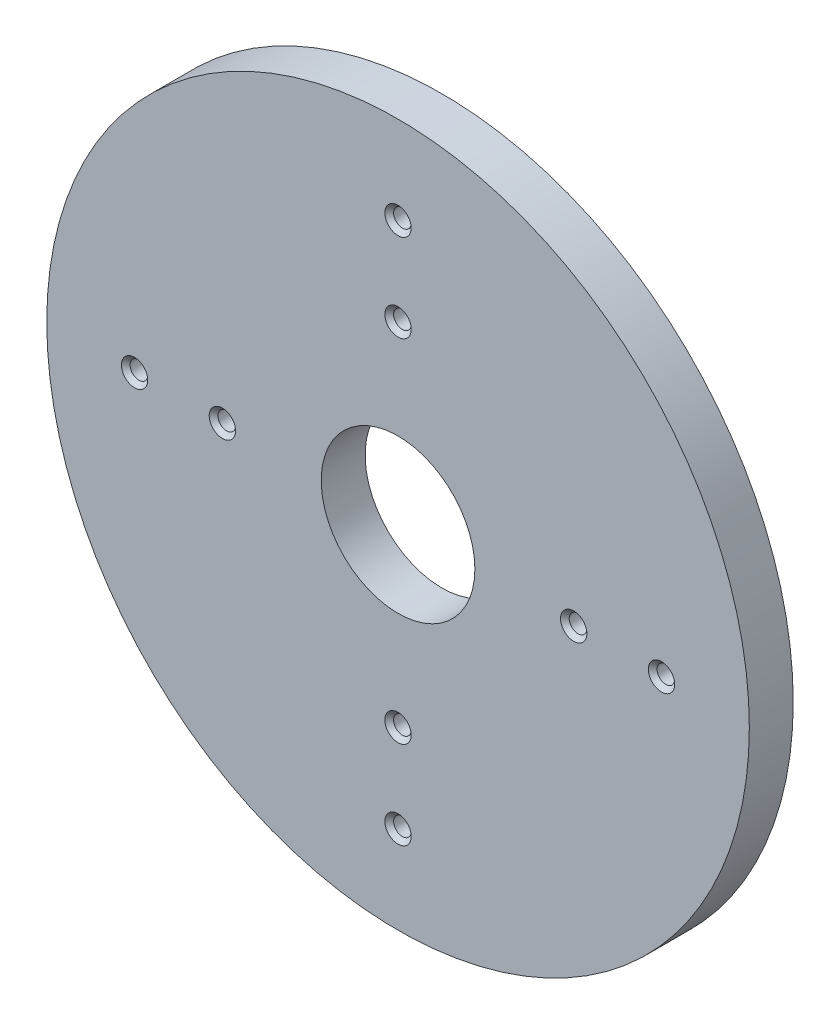
ISO-10303-21;
HEADER;
FILE_DESCRIPTION(('STEP AP214'),'2;1');
FILE_NAME('part.step','',(''),(''),'','','');
FILE_SCHEMA(('AUTOMOTIVE_DESIGN { 1 0 10303 214 1 1 1 1 }'));
ENDSEC;
DATA;
#1=APPLICATION_CONTEXT('core data for automotive mechanical design processes');
#2=APPLICATION_PROTOCOL_DEFINITION('international standard','automotive_design',2000,#1);
#3=PRODUCT_CONTEXT('',#1,'mechanical');
#4=PRODUCT('Part','Part','',(#3));
#5=PRODUCT_RELATED_PRODUCT_CATEGORY('part','',(#4));
#6=PRODUCT_DEFINITION_FORMATION('','',#4);
#7=PRODUCT_DEFINITION_CONTEXT('part definition',#1,'design');
#8=PRODUCT_DEFINITION('design','',#6,#7);
#9=PRODUCT_DEFINITION_SHAPE('','',#8);
#10=(LENGTH_UNIT() NAMED_UNIT(*) SI_UNIT(.MILLI.,.METRE.));
#11=(NAMED_UNIT(*) PLANE_ANGLE_UNIT() SI_UNIT($,.RADIAN.));
#12=(NAMED_UNIT(*) SI_UNIT($,.STERADIAN.) SOLID_ANGLE_UNIT());
#13=UNCERTAINTY_MEASURE_WITH_UNIT(LENGTH_MEASURE(1.E-05),#10,'distance_accuracy_value','');
#14=(GEOMETRIC_REPRESENTATION_CONTEXT(3) GLOBAL_UNCERTAINTY_ASSIGNED_CONTEXT((#13)) GLOBAL_UNIT_ASSIGNED_CONTEXT((#10,
#11,#12)) REPRESENTATION_CONTEXT('',''));
#15=CARTESIAN_POINT('',(0.,0.,0.));
#16=DIRECTION('',(0.,0.,1.));
#17=DIRECTION('',(1.,0.,0.));
#18=AXIS2_PLACEMENT_3D('',#15,#16,#17);
#19=CARTESIAN_POINT('',(0.,0.,12.7));
#20=DIRECTION('',(0.,0.,1.));
#21=DIRECTION('',(1.,0.,0.));
#22=AXIS2_PLACEMENT_3D('',#19,#20,#21);
#23=PLANE('',#22);
#24=CARTESIAN_POINT('',(0.,76.2,12.7));
#25=DIRECTION('',(0.,0.,1.));
#26=DIRECTION('',(1.,0.,0.));
#27=AXIS2_PLACEMENT_3D('',#24,#25,#26);
#28=CIRCLE('',#27,3.81);
#29=CARTESIAN_POINT('',(3.81,76.2,12.7));
#30=VERTEX_POINT('',#29);
#31=EDGE_CURVE('E149',#30,#30,#28,.T.);
#32=ORIENTED_EDGE('',*,*,#31,.F.);
#33=EDGE_LOOP('',(#32));
#34=FACE_BOUND('',#33,.T.);
#35=CARTESIAN_POINT('',(0.,50.8,12.7));
#36=DIRECTION('',(0.,0.,1.));
#37=DIRECTION('',(1.,0.,0.));
#38=AXIS2_PLACEMENT_3D('',#35,#36,#37);
#39=CIRCLE('',#38,3.81);
#40=CARTESIAN_POINT('',(3.81,50.8,12.7));
#41=VERTEX_POINT('',#40);
#42=EDGE_CURVE('E137',#41,#41,#39,.T.);
#43=ORIENTED_EDGE('',*,*,#42,.F.);
#44=EDGE_LOOP('',(#43));
#45=FACE_BOUND('',#44,.T.);
#46=CARTESIAN_POINT('',(76.2000000000014,1.43604633188994E-12,12.7));
#47=DIRECTION('',(0.,0.,1.));
#48=DIRECTION('',(1.,0.,0.));
#49=AXIS2_PLACEMENT_3D('',#46,#47,#48);
#50=CIRCLE('',#49,3.80999999999999);
#51=CARTESIAN_POINT('',(80.0100000000014,1.43604633188994E-12,12.7));
#52=VERTEX_POINT('',#51);
#53=EDGE_CURVE('E125',#52,#52,#50,.T.);
#54=ORIENTED_EDGE('',*,*,#53,.F.);
#55=EDGE_LOOP('',(#54));
#56=FACE_BOUND('',#55,.T.);
#57=CARTESIAN_POINT('',(50.8000000000014,1.43449103045502E-12,12.7));
#58=DIRECTION('',(0.,0.,1.));
#59=DIRECTION('',(1.,0.,0.));
#60=AXIS2_PLACEMENT_3D('',#57,#58,#59);
#61=CIRCLE('',#60,3.81);
#62=CARTESIAN_POINT('',(54.6100000000014,1.43449103045502E-12,12.7));
#63=VERTEX_POINT('',#62);
#64=EDGE_CURVE('E113',#63,#63,#61,.T.);
#65=ORIENTED_EDGE('',*,*,#64,.F.);
#66=EDGE_LOOP('',(#65));
#67=FACE_BOUND('',#66,.T.);
#68=CARTESIAN_POINT('',(2.87209266377988E-12,-76.2,12.7));
#69=DIRECTION('',(0.,0.,1.));
#70=DIRECTION('',(1.,0.,0.));
#71=AXIS2_PLACEMENT_3D('',#68,#69,#70);
#72=CIRCLE('',#71,3.81);
#73=CARTESIAN_POINT('',(3.81000000000287,-76.2,12.7));
#74=VERTEX_POINT('',#73);
#75=EDGE_CURVE('E101',#74,#74,#72,.T.);
#76=ORIENTED_EDGE('',*,*,#75,.F.);
#77=EDGE_LOOP('',(#76));
#78=FACE_BOUND('',#77,.T.);
#79=CARTESIAN_POINT('',(2.86898206091004E-12,-50.8,12.7));
#80=DIRECTION('',(0.,0.,1.));
#81=DIRECTION('',(1.,0.,0.));
#82=AXIS2_PLACEMENT_3D('',#79,#80,#81);
#83=CIRCLE('',#82,3.81);
#84=CARTESIAN_POINT('',(3.81000000000287,-50.8,12.7));
#85=VERTEX_POINT('',#84);
#86=EDGE_CURVE('E89',#85,#85,#83,.T.);
#87=ORIENTED_EDGE('',*,*,#86,.F.);
#88=EDGE_LOOP('',(#87));
#89=FACE_BOUND('',#88,.T.);
#90=CARTESIAN_POINT('',(-76.1999999999986,-1.42671452328043E-12,12.7));
#91=DIRECTION('',(0.,0.,1.));
#92=DIRECTION('',(1.,0.,0.));
#93=AXIS2_PLACEMENT_3D('',#90,#91,#92);
#94=CIRCLE('',#93,3.80999999999999);
#95=CARTESIAN_POINT('',(-72.3899999999986,-1.42671452328043E-12,12.7));
#96=VERTEX_POINT('',#95);
#97=EDGE_CURVE('E77',#96,#96,#94,.T.);
#98=ORIENTED_EDGE('',*,*,#97,.F.);
#99=EDGE_LOOP('',(#98));
#100=FACE_BOUND('',#99,.T.);
#101=CARTESIAN_POINT('',(-50.7999999999986,-1.42826982471535E-12,12.7));
#102=DIRECTION('',(0.,0.,1.));
#103=DIRECTION('',(1.,0.,0.));
#104=AXIS2_PLACEMENT_3D('',#101,#102,#103);
#105=CIRCLE('',#104,3.81);
#106=CARTESIAN_POINT('',(-46.9899999999986,-1.42826982471535E-12,12.7));
#107=VERTEX_POINT('',#106);
#108=EDGE_CURVE('E65',#107,#107,#105,.T.);
#109=ORIENTED_EDGE('',*,*,#108,.F.);
#110=EDGE_LOOP('',(#109));
#111=FACE_BOUND('',#110,.T.);
#112=CARTESIAN_POINT('',(0.,0.,12.7));
#113=DIRECTION('',(0.,0.,1.));
#114=DIRECTION('',(1.,0.,0.));
#115=AXIS2_PLACEMENT_3D('',#112,#113,#114);
#116=CIRCLE('',#115,101.6);
#117=CARTESIAN_POINT('',(101.6,0.,12.7));
#118=VERTEX_POINT('',#117);
#119=EDGE_CURVE('E10',#118,#118,#116,.T.);
#120=ORIENTED_EDGE('',*,*,#119,.T.);
#121=EDGE_LOOP('',(#120));
#122=FACE_BOUND('',#121,.T.);
#123=CARTESIAN_POINT('',(0.,0.,12.7));
#124=DIRECTION('',(0.,0.,1.));
#125=DIRECTION('',(1.,0.,0.));
#126=AXIS2_PLACEMENT_3D('',#123,#124,#125);
#127=CIRCLE('',#126,22.225);
#128=CARTESIAN_POINT('',(22.225,0.,12.7));
#129=VERTEX_POINT('',#128);
#130=EDGE_CURVE('E52',#129,#129,#127,.T.);
#131=ORIENTED_EDGE('',*,*,#130,.F.);
#132=EDGE_LOOP('',(#131));
#133=FACE_BOUND('',#132,.T.);
#134=ADVANCED_FACE('F41',(#34,#45,#56,#67,#78,#89,#100,#111,#122,#133),#23,.T.);
#135=CARTESIAN_POINT('',(0.,0.,0.));
#136=DIRECTION('',(0.,0.,1.));
#137=DIRECTION('',(1.,0.,0.));
#138=AXIS2_PLACEMENT_3D('',#135,#136,#137);
#139=PLANE('',#138);
#140=CARTESIAN_POINT('',(0.,76.2,0.));
#141=DIRECTION('',(0.,0.,1.));
#142=DIRECTION('',(1.,0.,0.));
#143=AXIS2_PLACEMENT_3D('',#140,#141,#142);
#144=CIRCLE('',#143,3.81);
#145=CARTESIAN_POINT('',(3.81,76.2,0.));
#146=VERTEX_POINT('',#145);
#147=EDGE_CURVE('E152',#146,#146,#144,.T.);
#148=ORIENTED_EDGE('',*,*,#147,.T.);
#149=EDGE_LOOP('',(#148));
#150=FACE_BOUND('',#149,.T.);
#151=CARTESIAN_POINT('',(0.,50.8,0.));
#152=DIRECTION('',(0.,0.,1.));
#153=DIRECTION('',(1.,0.,0.));
#154=AXIS2_PLACEMENT_3D('',#151,#152,#153);
#155=CIRCLE('',#154,3.81);
#156=CARTESIAN_POINT('',(3.81,50.8,0.));
#157=VERTEX_POINT('',#156);
#158=EDGE_CURVE('E140',#157,#157,#155,.T.);
#159=ORIENTED_EDGE('',*,*,#158,.T.);
#160=EDGE_LOOP('',(#159));
#161=FACE_BOUND('',#160,.T.);
#162=CARTESIAN_POINT('',(76.2000000000014,1.43604633188994E-12,0.));
#163=DIRECTION('',(0.,0.,1.));
#164=DIRECTION('',(1.,0.,0.));
#165=AXIS2_PLACEMENT_3D('',#162,#163,#164);
#166=CIRCLE('',#165,3.80999999999999);
#167=CARTESIAN_POINT('',(80.0100000000014,1.43604633188994E-12,0.));
#168=VERTEX_POINT('',#167);
#169=EDGE_CURVE('E128',#168,#168,#166,.T.);
#170=ORIENTED_EDGE('',*,*,#169,.T.);
#171=EDGE_LOOP('',(#170));
#172=FACE_BOUND('',#171,.T.);
#173=CARTESIAN_POINT('',(50.8000000000014,1.43449103045502E-12,0.));
#174=DIRECTION('',(0.,0.,1.));
#175=DIRECTION('',(1.,0.,0.));
#176=AXIS2_PLACEMENT_3D('',#173,#174,#175);
#177=CIRCLE('',#176,3.80999999999999);
#178=CARTESIAN_POINT('',(54.6100000000014,1.43449103045502E-12,0.));
#179=VERTEX_POINT('',#178);
#180=EDGE_CURVE('E116',#179,#179,#177,.T.);
#181=ORIENTED_EDGE('',*,*,#180,.T.);
#182=EDGE_LOOP('',(#181));
#183=FACE_BOUND('',#182,.T.);
#184=CARTESIAN_POINT('',(2.87209266377988E-12,-76.2,0.));
#185=DIRECTION('',(0.,0.,1.));
#186=DIRECTION('',(1.,0.,0.));
#187=AXIS2_PLACEMENT_3D('',#184,#185,#186);
#188=CIRCLE('',#187,3.81);
#189=CARTESIAN_POINT('',(3.81000000000287,-76.2,0.));
#190=VERTEX_POINT('',#189);
#191=EDGE_CURVE('E104',#190,#190,#188,.T.);
#192=ORIENTED_EDGE('',*,*,#191,.T.);
#193=EDGE_LOOP('',(#192));
#194=FACE_BOUND('',#193,.T.);
#195=CARTESIAN_POINT('',(2.86898206091004E-12,-50.8,0.));
#196=DIRECTION('',(0.,0.,1.));
#197=DIRECTION('',(1.,0.,0.));
#198=AXIS2_PLACEMENT_3D('',#195,#196,#197);
#199=CIRCLE('',#198,3.81);
#200=CARTESIAN_POINT('',(3.81000000000287,-50.8,0.));
#201=VERTEX_POINT('',#200);
#202=EDGE_CURVE('E92',#201,#201,#199,.T.);
#203=ORIENTED_EDGE('',*,*,#202,.T.);
#204=EDGE_LOOP('',(#203));
#205=FACE_BOUND('',#204,.T.);
#206=CARTESIAN_POINT('',(-76.1999999999986,-1.42671452328043E-12,0.));
#207=DIRECTION('',(0.,0.,1.));
#208=DIRECTION('',(1.,0.,0.));
#209=AXIS2_PLACEMENT_3D('',#206,#207,#208);
#210=CIRCLE('',#209,3.80999999999999);
#211=CARTESIAN_POINT('',(-72.3899999999986,-1.42671452328043E-12,0.));
#212=VERTEX_POINT('',#211);
#213=EDGE_CURVE('E80',#212,#212,#210,.T.);
#214=ORIENTED_EDGE('',*,*,#213,.T.);
#215=EDGE_LOOP('',(#214));
#216=FACE_BOUND('',#215,.T.);
#217=CARTESIAN_POINT('',(-50.7999999999986,-1.42826982471535E-12,0.));
#218=DIRECTION('',(0.,0.,1.));
#219=DIRECTION('',(1.,0.,0.));
#220=AXIS2_PLACEMENT_3D('',#217,#218,#219);
#221=CIRCLE('',#220,3.80999999999999);
#222=CARTESIAN_POINT('',(-46.9899999999986,-1.42826982471535E-12,0.));
#223=VERTEX_POINT('',#222);
#224=EDGE_CURVE('E68',#223,#223,#221,.T.);
#225=ORIENTED_EDGE('',*,*,#224,.T.);
#226=EDGE_LOOP('',(#225));
#227=FACE_BOUND('',#226,.T.);
#228=CARTESIAN_POINT('',(0.,0.,0.));
#229=DIRECTION('',(0.,0.,1.));
#230=DIRECTION('',(1.,0.,0.));
#231=AXIS2_PLACEMENT_3D('',#228,#229,#230);
#232=CIRCLE('',#231,101.6);
#233=CARTESIAN_POINT('',(101.6,0.,0.));
#234=VERTEX_POINT('',#233);
#235=EDGE_CURVE('E45',#234,#234,#232,.T.);
#236=ORIENTED_EDGE('',*,*,#235,.F.);
#237=EDGE_LOOP('',(#236));
#238=FACE_BOUND('',#237,.T.);
#239=CARTESIAN_POINT('',(0.,0.,0.));
#240=DIRECTION('',(0.,0.,1.));
#241=DIRECTION('',(1.,0.,0.));
#242=AXIS2_PLACEMENT_3D('',#239,#240,#241);
#243=CIRCLE('',#242,22.225);
#244=CARTESIAN_POINT('',(22.225,0.,0.));
#245=VERTEX_POINT('',#244);
#246=EDGE_CURVE('E54',#245,#245,#243,.T.);
#247=ORIENTED_EDGE('',*,*,#246,.T.);
#248=EDGE_LOOP('',(#247));
#249=FACE_BOUND('',#248,.T.);
#250=ADVANCED_FACE('F156',(#150,#161,#172,#183,#194,#205,#216,#227,#238,#249),#139,.F.);
#251=CARTESIAN_POINT('',(0.,0.,12.7));
#252=DIRECTION('',(0.,0.,-1.));
#253=DIRECTION('',(-1.,0.,0.));
#254=AXIS2_PLACEMENT_3D('',#251,#252,#253);
#255=CYLINDRICAL_SURFACE('',#254,101.6);
#256=ORIENTED_EDGE('',*,*,#119,.F.);
#257=EDGE_LOOP('',(#256));
#258=FACE_BOUND('',#257,.T.);
#259=ORIENTED_EDGE('',*,*,#235,.T.);
#260=EDGE_LOOP('',(#259));
#261=FACE_BOUND('',#260,.T.);
#262=ADVANCED_FACE('F43',(#258,#261),#255,.T.);
#263=CARTESIAN_POINT('',(0.,0.,12.7));
#264=DIRECTION('',(0.,0.,-1.));
#265=DIRECTION('',(-1.,0.,0.));
#266=AXIS2_PLACEMENT_3D('',#263,#264,#265);
#267=CYLINDRICAL_SURFACE('',#266,22.225);
#268=ORIENTED_EDGE('',*,*,#130,.T.);
#269=EDGE_LOOP('',(#268));
#270=FACE_BOUND('',#269,.T.);
#271=ORIENTED_EDGE('',*,*,#246,.F.);
#272=EDGE_LOOP('',(#271));
#273=FACE_BOUND('',#272,.T.);
#274=ADVANCED_FACE('F197',(#270,#273),#267,.F.);
#275=CARTESIAN_POINT('',(-50.7999999999986,-1.42826982471535E-12,1.2573));
#276=DIRECTION('',(0.,0.,-1.));
#277=DIRECTION('',(-1.,0.,0.));
#278=AXIS2_PLACEMENT_3D('',#275,#276,#277);
#279=CONICAL_SURFACE('',#278,2.5527,0.785398163397446);
#280=ORIENTED_EDGE('',*,*,#224,.F.);
#281=EDGE_LOOP('',(#280));
#282=FACE_BOUND('',#281,.T.);
#283=CARTESIAN_POINT('',(-50.7999999999986,-1.42826982471535E-12,1.2573));
#284=DIRECTION('',(0.,0.,1.));
#285=DIRECTION('',(1.,0.,0.));
#286=AXIS2_PLACEMENT_3D('',#283,#284,#285);
#287=CIRCLE('',#286,2.5527);
#288=CARTESIAN_POINT('',(-48.2472999999986,-1.42826982471535E-12,1.2573));
#289=VERTEX_POINT('',#288);
#290=EDGE_CURVE('E57',#289,#289,#287,.T.);
#291=ORIENTED_EDGE('',*,*,#290,.T.);
#292=EDGE_LOOP('',(#291));
#293=FACE_BOUND('',#292,.T.);
#294=ADVANCED_FACE('F200',(#282,#293),#279,.F.);
#295=CARTESIAN_POINT('',(-50.7999999999986,-1.42826982471535E-12,12.7));
#296=DIRECTION('',(0.,0.,1.));
#297=DIRECTION('',(1.,0.,0.));
#298=AXIS2_PLACEMENT_3D('',#295,#296,#297);
#299=CYLINDRICAL_SURFACE('',#298,2.5527);
#300=ORIENTED_EDGE('',*,*,#290,.F.);
#301=EDGE_LOOP('',(#300));
#302=FACE_BOUND('',#301,.T.);
#303=CARTESIAN_POINT('',(-50.7999999999986,-1.42826982471535E-12,11.4427));
#304=DIRECTION('',(0.,0.,1.));
#305=DIRECTION('',(1.,0.,0.));
#306=AXIS2_PLACEMENT_3D('',#303,#304,#305);
#307=CIRCLE('',#306,2.5527);
#308=CARTESIAN_POINT('',(-48.2472999999986,-1.42826982471535E-12,11.4427));
#309=VERTEX_POINT('',#308);
#310=EDGE_CURVE('E62',#309,#309,#307,.T.);
#311=ORIENTED_EDGE('',*,*,#310,.T.);
#312=EDGE_LOOP('',(#311));
#313=FACE_BOUND('',#312,.T.);
#314=ADVANCED_FACE('F212',(#302,#313),#299,.F.);
#315=CARTESIAN_POINT('',(-50.7999999999986,-1.42826982471535E-12,12.7));
#316=DIRECTION('',(0.,0.,1.));
#317=DIRECTION('',(1.,0.,0.));
#318=AXIS2_PLACEMENT_3D('',#315,#316,#317);
#319=CONICAL_SURFACE('',#318,3.81,0.785398163397448);
#320=ORIENTED_EDGE('',*,*,#310,.F.);
#321=EDGE_LOOP('',(#320));
#322=FACE_BOUND('',#321,.T.);
#323=ORIENTED_EDGE('',*,*,#108,.T.);
#324=EDGE_LOOP('',(#323));
#325=FACE_BOUND('',#324,.T.);
#326=ADVANCED_FACE('F216',(#322,#325),#319,.F.);
#327=CARTESIAN_POINT('',(-76.1999999999986,-1.42671452328043E-12,1.2573));
#328=DIRECTION('',(0.,0.,-1.));
#329=DIRECTION('',(-1.,0.,0.));
#330=AXIS2_PLACEMENT_3D('',#327,#328,#329);
#331=CONICAL_SURFACE('',#330,2.55269999999999,0.785398163397448);
#332=ORIENTED_EDGE('',*,*,#213,.F.);
#333=EDGE_LOOP('',(#332));
#334=FACE_BOUND('',#333,.T.);
#335=CARTESIAN_POINT('',(-76.1999999999986,-1.42671452328043E-12,1.2573));
#336=DIRECTION('',(0.,0.,1.));
#337=DIRECTION('',(1.,0.,0.));
#338=AXIS2_PLACEMENT_3D('',#335,#336,#337);
#339=CIRCLE('',#338,2.55269999999999);
#340=CARTESIAN_POINT('',(-73.6472999999986,-1.42671452328043E-12,1.2573));
#341=VERTEX_POINT('',#340);
#342=EDGE_CURVE('E71',#341,#341,#339,.T.);
#343=ORIENTED_EDGE('',*,*,#342,.T.);
#344=EDGE_LOOP('',(#343));
#345=FACE_BOUND('',#344,.T.);
#346=ADVANCED_FACE('F220',(#334,#345),#331,.F.);
#347=CARTESIAN_POINT('',(-76.1999999999986,-1.42671452328043E-12,12.7));
#348=DIRECTION('',(0.,0.,1.));
#349=DIRECTION('',(1.,0.,0.));
#350=AXIS2_PLACEMENT_3D('',#347,#348,#349);
#351=CYLINDRICAL_SURFACE('',#350,2.5527);
#352=ORIENTED_EDGE('',*,*,#342,.F.);
#353=EDGE_LOOP('',(#352));
#354=FACE_BOUND('',#353,.T.);
#355=CARTESIAN_POINT('',(-76.1999999999986,-1.42671452328043E-12,11.4427));
#356=DIRECTION('',(0.,0.,1.));
#357=DIRECTION('',(1.,0.,0.));
#358=AXIS2_PLACEMENT_3D('',#355,#356,#357);
#359=CIRCLE('',#358,2.55270000000001);
#360=CARTESIAN_POINT('',(-73.6472999999986,-1.42671452328043E-12,11.4427));
#361=VERTEX_POINT('',#360);
#362=EDGE_CURVE('E74',#361,#361,#359,.T.);
#363=ORIENTED_EDGE('',*,*,#362,.T.);
#364=EDGE_LOOP('',(#363));
#365=FACE_BOUND('',#364,.T.);
#366=ADVANCED_FACE('F224',(#354,#365),#351,.F.);
#367=CARTESIAN_POINT('',(-76.1999999999986,-1.42671452328043E-12,12.7));
#368=DIRECTION('',(0.,0.,1.));
#369=DIRECTION('',(1.,0.,0.));
#370=AXIS2_PLACEMENT_3D('',#367,#368,#369);
#371=CONICAL_SURFACE('',#370,3.80999999999999,0.785398163397443);
#372=ORIENTED_EDGE('',*,*,#362,.F.);
#373=EDGE_LOOP('',(#372));
#374=FACE_BOUND('',#373,.T.);
#375=ORIENTED_EDGE('',*,*,#97,.T.);
#376=EDGE_LOOP('',(#375));
#377=FACE_BOUND('',#376,.T.);
#378=ADVANCED_FACE('F228',(#374,#377),#371,.F.);
#379=CARTESIAN_POINT('',(2.86898206091004E-12,-50.8,1.2573));
#380=DIRECTION('',(0.,0.,-1.));
#381=DIRECTION('',(-1.,0.,0.));
#382=AXIS2_PLACEMENT_3D('',#379,#380,#381);
#383=CONICAL_SURFACE('',#382,2.5527,0.785398163397447);
#384=ORIENTED_EDGE('',*,*,#202,.F.);
#385=EDGE_LOOP('',(#384));
#386=FACE_BOUND('',#385,.T.);
#387=CARTESIAN_POINT('',(2.86898206091004E-12,-50.8,1.2573));
#388=DIRECTION('',(0.,0.,1.));
#389=DIRECTION('',(1.,0.,0.));
#390=AXIS2_PLACEMENT_3D('',#387,#388,#389);
#391=CIRCLE('',#390,2.5527);
#392=CARTESIAN_POINT('',(2.55270000000287,-50.8,1.2573));
#393=VERTEX_POINT('',#392);
#394=EDGE_CURVE('E83',#393,#393,#391,.T.);
#395=ORIENTED_EDGE('',*,*,#394,.T.);
#396=EDGE_LOOP('',(#395));
#397=FACE_BOUND('',#396,.T.);
#398=ADVANCED_FACE('F232',(#386,#397),#383,.F.);
#399=CARTESIAN_POINT('',(2.86898206091004E-12,-50.8,12.7));
#400=DIRECTION('',(0.,0.,1.));
#401=DIRECTION('',(1.,0.,0.));
#402=AXIS2_PLACEMENT_3D('',#399,#400,#401);
#403=CYLINDRICAL_SURFACE('',#402,2.5527);
#404=ORIENTED_EDGE('',*,*,#394,.F.);
#405=EDGE_LOOP('',(#404));
#406=FACE_BOUND('',#405,.T.);
#407=CARTESIAN_POINT('',(2.86898206091004E-12,-50.8,11.4427));
#408=DIRECTION('',(0.,0.,1.));
#409=DIRECTION('',(1.,0.,0.));
#410=AXIS2_PLACEMENT_3D('',#407,#408,#409);
#411=CIRCLE('',#410,2.5527);
#412=CARTESIAN_POINT('',(2.55270000000287,-50.8,11.4427));
#413=VERTEX_POINT('',#412);
#414=EDGE_CURVE('E86',#413,#413,#411,.T.);
#415=ORIENTED_EDGE('',*,*,#414,.T.);
#416=EDGE_LOOP('',(#415));
#417=FACE_BOUND('',#416,.T.);
#418=ADVANCED_FACE('F236',(#406,#417),#403,.F.);
#419=CARTESIAN_POINT('',(2.86898206091004E-12,-50.8,12.7));
#420=DIRECTION('',(0.,0.,1.));
#421=DIRECTION('',(1.,0.,0.));
#422=AXIS2_PLACEMENT_3D('',#419,#420,#421);
#423=CONICAL_SURFACE('',#422,3.81,0.785398163397447);
#424=ORIENTED_EDGE('',*,*,#414,.F.);
#425=EDGE_LOOP('',(#424));
#426=FACE_BOUND('',#425,.T.);
#427=ORIENTED_EDGE('',*,*,#86,.T.);
#428=EDGE_LOOP('',(#427));
#429=FACE_BOUND('',#428,.T.);
#430=ADVANCED_FACE('F240',(#426,#429),#423,.F.);
#431=CARTESIAN_POINT('',(2.87209266377988E-12,-76.2,1.2573));
#432=DIRECTION('',(0.,0.,-1.));
#433=DIRECTION('',(-1.,0.,0.));
#434=AXIS2_PLACEMENT_3D('',#431,#432,#433);
#435=CONICAL_SURFACE('',#434,2.5527,0.785398163397447);
#436=ORIENTED_EDGE('',*,*,#191,.F.);
#437=EDGE_LOOP('',(#436));
#438=FACE_BOUND('',#437,.T.);
#439=CARTESIAN_POINT('',(2.87209266377988E-12,-76.2,1.2573));
#440=DIRECTION('',(0.,0.,1.));
#441=DIRECTION('',(1.,0.,0.));
#442=AXIS2_PLACEMENT_3D('',#439,#440,#441);
#443=CIRCLE('',#442,2.5527);
#444=CARTESIAN_POINT('',(2.55270000000287,-76.2,1.2573));
#445=VERTEX_POINT('',#444);
#446=EDGE_CURVE('E95',#445,#445,#443,.T.);
#447=ORIENTED_EDGE('',*,*,#446,.T.);
#448=EDGE_LOOP('',(#447));
#449=FACE_BOUND('',#448,.T.);
#450=ADVANCED_FACE('F244',(#438,#449),#435,.F.);
#451=CARTESIAN_POINT('',(2.87209266377988E-12,-76.2,12.7));
#452=DIRECTION('',(0.,0.,1.));
#453=DIRECTION('',(1.,0.,0.));
#454=AXIS2_PLACEMENT_3D('',#451,#452,#453);
#455=CYLINDRICAL_SURFACE('',#454,2.5527);
#456=ORIENTED_EDGE('',*,*,#446,.F.);
#457=EDGE_LOOP('',(#456));
#458=FACE_BOUND('',#457,.T.);
#459=CARTESIAN_POINT('',(2.87209266377988E-12,-76.2,11.4427));
#460=DIRECTION('',(0.,0.,1.));
#461=DIRECTION('',(1.,0.,0.));
#462=AXIS2_PLACEMENT_3D('',#459,#460,#461);
#463=CIRCLE('',#462,2.5527);
#464=CARTESIAN_POINT('',(2.55270000000287,-76.2,11.4427));
#465=VERTEX_POINT('',#464);
#466=EDGE_CURVE('E98',#465,#465,#463,.T.);
#467=ORIENTED_EDGE('',*,*,#466,.T.);
#468=EDGE_LOOP('',(#467));
#469=FACE_BOUND('',#468,.T.);
#470=ADVANCED_FACE('F248',(#458,#469),#455,.F.);
#471=CARTESIAN_POINT('',(2.87209266377988E-12,-76.2,12.7));
#472=DIRECTION('',(0.,0.,1.));
#473=DIRECTION('',(1.,0.,0.));
#474=AXIS2_PLACEMENT_3D('',#471,#472,#473);
#475=CONICAL_SURFACE('',#474,3.81,0.785398163397447);
#476=ORIENTED_EDGE('',*,*,#466,.F.);
#477=EDGE_LOOP('',(#476));
#478=FACE_BOUND('',#477,.T.);
#479=ORIENTED_EDGE('',*,*,#75,.T.);
#480=EDGE_LOOP('',(#479));
#481=FACE_BOUND('',#480,.T.);
#482=ADVANCED_FACE('F252',(#478,#481),#475,.F.);
#483=CARTESIAN_POINT('',(50.8000000000014,1.43449103045502E-12,1.2573));
#484=DIRECTION('',(0.,0.,-1.));
#485=DIRECTION('',(-1.,0.,0.));
#486=AXIS2_PLACEMENT_3D('',#483,#484,#485);
#487=CONICAL_SURFACE('',#486,2.5527,0.785398163397446);
#488=ORIENTED_EDGE('',*,*,#180,.F.);
#489=EDGE_LOOP('',(#488));
#490=FACE_BOUND('',#489,.T.);
#491=CARTESIAN_POINT('',(50.8000000000014,1.43449103045502E-12,1.2573));
#492=DIRECTION('',(0.,0.,1.));
#493=DIRECTION('',(1.,0.,0.));
#494=AXIS2_PLACEMENT_3D('',#491,#492,#493);
#495=CIRCLE('',#494,2.5527);
#496=CARTESIAN_POINT('',(53.3527000000014,1.43449103045502E-12,1.2573));
#497=VERTEX_POINT('',#496);
#498=EDGE_CURVE('E107',#497,#497,#495,.T.);
#499=ORIENTED_EDGE('',*,*,#498,.T.);
#500=EDGE_LOOP('',(#499));
#501=FACE_BOUND('',#500,.T.);
#502=ADVANCED_FACE('F256',(#490,#501),#487,.F.);
#503=CARTESIAN_POINT('',(50.8000000000014,1.43449103045502E-12,12.7));
#504=DIRECTION('',(0.,0.,1.));
#505=DIRECTION('',(1.,0.,0.));
#506=AXIS2_PLACEMENT_3D('',#503,#504,#505);
#507=CYLINDRICAL_SURFACE('',#506,2.5527);
#508=ORIENTED_EDGE('',*,*,#498,.F.);
#509=EDGE_LOOP('',(#508));
#510=FACE_BOUND('',#509,.T.);
#511=CARTESIAN_POINT('',(50.8000000000014,1.43449103045502E-12,11.4427));
#512=DIRECTION('',(0.,0.,1.));
#513=DIRECTION('',(1.,0.,0.));
#514=AXIS2_PLACEMENT_3D('',#511,#512,#513);
#515=CIRCLE('',#514,2.5527);
#516=CARTESIAN_POINT('',(53.3527000000014,1.43449103045502E-12,11.4427));
#517=VERTEX_POINT('',#516);
#518=EDGE_CURVE('E110',#517,#517,#515,.T.);
#519=ORIENTED_EDGE('',*,*,#518,.T.);
#520=EDGE_LOOP('',(#519));
#521=FACE_BOUND('',#520,.T.);
#522=ADVANCED_FACE('F260',(#510,#521),#507,.F.);
#523=CARTESIAN_POINT('',(50.8000000000014,1.43449103045502E-12,12.7));
#524=DIRECTION('',(0.,0.,1.));
#525=DIRECTION('',(1.,0.,0.));
#526=AXIS2_PLACEMENT_3D('',#523,#524,#525);
#527=CONICAL_SURFACE('',#526,3.81,0.785398163397448);
#528=ORIENTED_EDGE('',*,*,#518,.F.);
#529=EDGE_LOOP('',(#528));
#530=FACE_BOUND('',#529,.T.);
#531=ORIENTED_EDGE('',*,*,#64,.T.);
#532=EDGE_LOOP('',(#531));
#533=FACE_BOUND('',#532,.T.);
#534=ADVANCED_FACE('F264',(#530,#533),#527,.F.);
#535=CARTESIAN_POINT('',(76.2000000000014,1.43604633188994E-12,1.2573));
#536=DIRECTION('',(0.,0.,-1.));
#537=DIRECTION('',(-1.,0.,0.));
#538=AXIS2_PLACEMENT_3D('',#535,#536,#537);
#539=CONICAL_SURFACE('',#538,2.55269999999999,0.785398163397448);
#540=ORIENTED_EDGE('',*,*,#169,.F.);
#541=EDGE_LOOP('',(#540));
#542=FACE_BOUND('',#541,.T.);
#543=CARTESIAN_POINT('',(76.2000000000014,1.43604633188994E-12,1.2573));
#544=DIRECTION('',(0.,0.,1.));
#545=DIRECTION('',(1.,0.,0.));
#546=AXIS2_PLACEMENT_3D('',#543,#544,#545);
#547=CIRCLE('',#546,2.55269999999999);
#548=CARTESIAN_POINT('',(78.7527000000014,1.43604633188994E-12,1.2573));
#549=VERTEX_POINT('',#548);
#550=EDGE_CURVE('E119',#549,#549,#547,.T.);
#551=ORIENTED_EDGE('',*,*,#550,.T.);
#552=EDGE_LOOP('',(#551));
#553=FACE_BOUND('',#552,.T.);
#554=ADVANCED_FACE('F268',(#542,#553),#539,.F.);
#555=CARTESIAN_POINT('',(76.2000000000014,1.43604633188994E-12,12.7));
#556=DIRECTION('',(0.,0.,1.));
#557=DIRECTION('',(1.,0.,0.));
#558=AXIS2_PLACEMENT_3D('',#555,#556,#557);
#559=CYLINDRICAL_SURFACE('',#558,2.5527);
#560=ORIENTED_EDGE('',*,*,#550,.F.);
#561=EDGE_LOOP('',(#560));
#562=FACE_BOUND('',#561,.T.);
#563=CARTESIAN_POINT('',(76.2000000000014,1.43604633188994E-12,11.4427));
#564=DIRECTION('',(0.,0.,1.));
#565=DIRECTION('',(1.,0.,0.));
#566=AXIS2_PLACEMENT_3D('',#563,#564,#565);
#567=CIRCLE('',#566,2.55270000000001);
#568=CARTESIAN_POINT('',(78.7527000000014,1.43604633188994E-12,11.4427));
#569=VERTEX_POINT('',#568);
#570=EDGE_CURVE('E122',#569,#569,#567,.T.);
#571=ORIENTED_EDGE('',*,*,#570,.T.);
#572=EDGE_LOOP('',(#571));
#573=FACE_BOUND('',#572,.T.);
#574=ADVANCED_FACE('F272',(#562,#573),#559,.F.);
#575=CARTESIAN_POINT('',(76.2000000000014,1.43604633188994E-12,12.7));
#576=DIRECTION('',(0.,0.,1.));
#577=DIRECTION('',(1.,0.,0.));
#578=AXIS2_PLACEMENT_3D('',#575,#576,#577);
#579=CONICAL_SURFACE('',#578,3.80999999999999,0.785398163397443);
#580=ORIENTED_EDGE('',*,*,#570,.F.);
#581=EDGE_LOOP('',(#580));
#582=FACE_BOUND('',#581,.T.);
#583=ORIENTED_EDGE('',*,*,#53,.T.);
#584=EDGE_LOOP('',(#583));
#585=FACE_BOUND('',#584,.T.);
#586=ADVANCED_FACE('F276',(#582,#585),#579,.F.);
#587=CARTESIAN_POINT('',(0.,50.8,1.2573));
#588=DIRECTION('',(0.,0.,-1.));
#589=DIRECTION('',(-1.,0.,0.));
#590=AXIS2_PLACEMENT_3D('',#587,#588,#589);
#591=CONICAL_SURFACE('',#590,2.5527,0.785398163397447);
#592=ORIENTED_EDGE('',*,*,#158,.F.);
#593=EDGE_LOOP('',(#592));
#594=FACE_BOUND('',#593,.T.);
#595=CARTESIAN_POINT('',(0.,50.8,1.2573));
#596=DIRECTION('',(0.,0.,1.));
#597=DIRECTION('',(1.,0.,0.));
#598=AXIS2_PLACEMENT_3D('',#595,#596,#597);
#599=CIRCLE('',#598,2.5527);
#600=CARTESIAN_POINT('',(2.5527,50.8,1.2573));
#601=VERTEX_POINT('',#600);
#602=EDGE_CURVE('E131',#601,#601,#599,.T.);
#603=ORIENTED_EDGE('',*,*,#602,.T.);
#604=EDGE_LOOP('',(#603));
#605=FACE_BOUND('',#604,.T.);
#606=ADVANCED_FACE('F280',(#594,#605),#591,.F.);
#607=CARTESIAN_POINT('',(0.,50.8,12.7));
#608=DIRECTION('',(0.,0.,1.));
#609=DIRECTION('',(1.,0.,0.));
#610=AXIS2_PLACEMENT_3D('',#607,#608,#609);
#611=CYLINDRICAL_SURFACE('',#610,2.5527);
#612=ORIENTED_EDGE('',*,*,#602,.F.);
#613=EDGE_LOOP('',(#612));
#614=FACE_BOUND('',#613,.T.);
#615=CARTESIAN_POINT('',(0.,50.8,11.4427));
#616=DIRECTION('',(0.,0.,1.));
#617=DIRECTION('',(1.,0.,0.));
#618=AXIS2_PLACEMENT_3D('',#615,#616,#617);
#619=CIRCLE('',#618,2.5527);
#620=CARTESIAN_POINT('',(2.5527,50.8,11.4427));
#621=VERTEX_POINT('',#620);
#622=EDGE_CURVE('E134',#621,#621,#619,.T.);
#623=ORIENTED_EDGE('',*,*,#622,.T.);
#624=EDGE_LOOP('',(#623));
#625=FACE_BOUND('',#624,.T.);
#626=ADVANCED_FACE('F284',(#614,#625),#611,.F.);
#627=CARTESIAN_POINT('',(0.,50.8,12.7));
#628=DIRECTION('',(0.,0.,1.));
#629=DIRECTION('',(1.,0.,0.));
#630=AXIS2_PLACEMENT_3D('',#627,#628,#629);
#631=CONICAL_SURFACE('',#630,3.81,0.785398163397447);
#632=ORIENTED_EDGE('',*,*,#622,.F.);
#633=EDGE_LOOP('',(#632));
#634=FACE_BOUND('',#633,.T.);
#635=ORIENTED_EDGE('',*,*,#42,.T.);
#636=EDGE_LOOP('',(#635));
#637=FACE_BOUND('',#636,.T.);
#638=ADVANCED_FACE('F163',(#634,#637),#631,.F.);
#639=CARTESIAN_POINT('',(0.,76.2,1.2573));
#640=DIRECTION('',(0.,0.,-1.));
#641=DIRECTION('',(-1.,0.,0.));
#642=AXIS2_PLACEMENT_3D('',#639,#640,#641);
#643=CONICAL_SURFACE('',#642,2.5527,0.785398163397447);
#644=ORIENTED_EDGE('',*,*,#147,.F.);
#645=EDGE_LOOP('',(#644));
#646=FACE_BOUND('',#645,.T.);
#647=CARTESIAN_POINT('',(0.,76.2,1.2573));
#648=DIRECTION('',(0.,0.,1.));
#649=DIRECTION('',(1.,0.,0.));
#650=AXIS2_PLACEMENT_3D('',#647,#648,#649);
#651=CIRCLE('',#650,2.5527);
#652=CARTESIAN_POINT('',(2.5527,76.2,1.2573));
#653=VERTEX_POINT('',#652);
#654=EDGE_CURVE('E143',#653,#653,#651,.T.);
#655=ORIENTED_EDGE('',*,*,#654,.T.);
#656=EDGE_LOOP('',(#655));
#657=FACE_BOUND('',#656,.T.);
#658=ADVANCED_FACE('F159',(#646,#657),#643,.F.);
#659=CARTESIAN_POINT('',(0.,76.2,12.7));
#660=DIRECTION('',(0.,0.,1.));
#661=DIRECTION('',(1.,0.,0.));
#662=AXIS2_PLACEMENT_3D('',#659,#660,#661);
#663=CYLINDRICAL_SURFACE('',#662,2.5527);
#664=ORIENTED_EDGE('',*,*,#654,.F.);
#665=EDGE_LOOP('',(#664));
#666=FACE_BOUND('',#665,.T.);
#667=CARTESIAN_POINT('',(0.,76.2,11.4427));
#668=DIRECTION('',(0.,0.,1.));
#669=DIRECTION('',(1.,0.,0.));
#670=AXIS2_PLACEMENT_3D('',#667,#668,#669);
#671=CIRCLE('',#670,2.5527);
#672=CARTESIAN_POINT('',(2.5527,76.2,11.4427));
#673=VERTEX_POINT('',#672);
#674=EDGE_CURVE('E146',#673,#673,#671,.T.);
#675=ORIENTED_EDGE('',*,*,#674,.T.);
#676=EDGE_LOOP('',(#675));
#677=FACE_BOUND('',#676,.T.);
#678=ADVANCED_FACE('F162',(#666,#677),#663,.F.);
#679=CARTESIAN_POINT('',(0.,76.2,12.7));
#680=DIRECTION('',(0.,0.,1.));
#681=DIRECTION('',(1.,0.,0.));
#682=AXIS2_PLACEMENT_3D('',#679,#680,#681);
#683=CONICAL_SURFACE('',#682,3.81,0.785398163397447);
#684=ORIENTED_EDGE('',*,*,#674,.F.);
#685=EDGE_LOOP('',(#684));
#686=FACE_BOUND('',#685,.T.);
#687=ORIENTED_EDGE('',*,*,#31,.T.);
#688=EDGE_LOOP('',(#687));
#689=FACE_BOUND('',#688,.T.);
#690=ADVANCED_FACE('F169',(#686,#689),#683,.F.);
#691=CLOSED_SHELL('',(#134,#250,#262,#274,#294,#314,#326,#346,#366,#378,#398,#418,#430,#450,
#470,#482,#502,#522,#534,#554,#574,#586,#606,#626,#638,#658,#678,#690));
#692=MANIFOLD_SOLID_BREP('B2',#691);
#693=ADVANCED_BREP_SHAPE_REPRESENTATION('',(#18,#692),#14);
#694=SHAPE_DEFINITION_REPRESENTATION(#9,#693);
ENDSEC;
END-ISO-10303-21;
